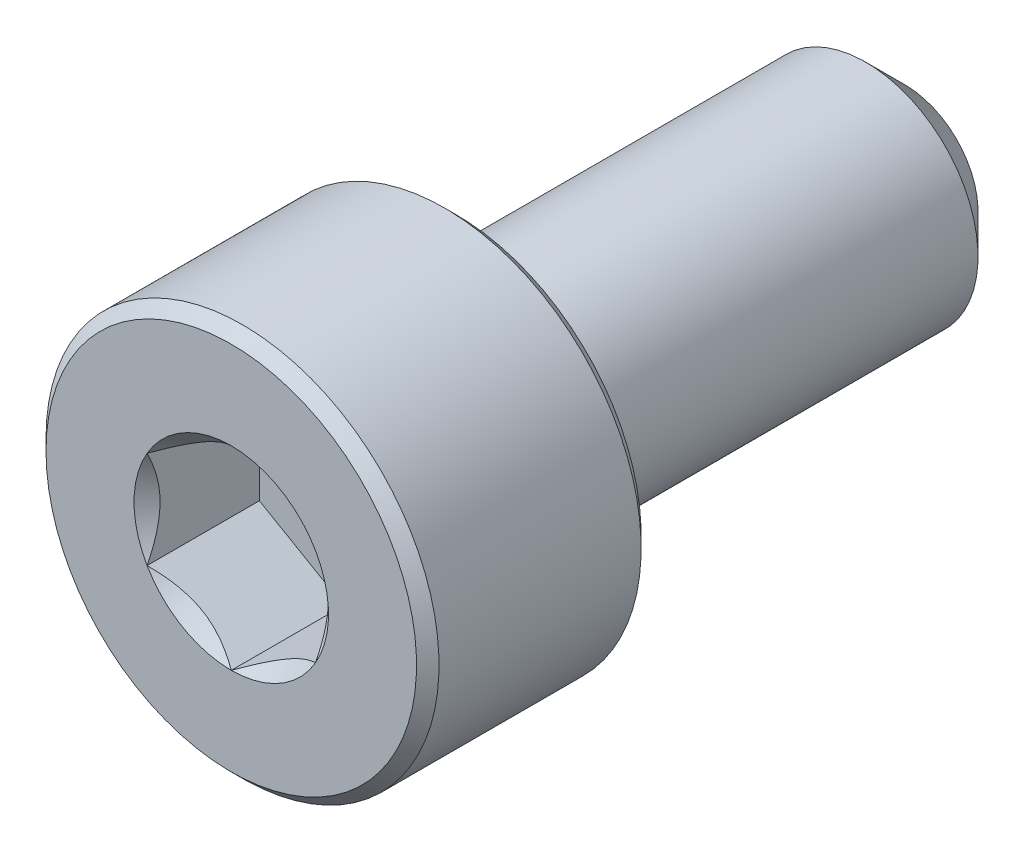
ISO-10303-21;
HEADER;
FILE_DESCRIPTION(('STEP AP214'),'2;1');
FILE_NAME('part.step','',(''),(''),'','','');
FILE_SCHEMA(('AUTOMOTIVE_DESIGN { 1 0 10303 214 1 1 1 1 }'));
ENDSEC;
DATA;
#1=APPLICATION_CONTEXT('core data for automotive mechanical design processes');
#2=APPLICATION_PROTOCOL_DEFINITION('international standard','automotive_design',2000,#1);
#3=PRODUCT_CONTEXT('',#1,'mechanical');
#4=PRODUCT('Part','Part','',(#3));
#5=PRODUCT_RELATED_PRODUCT_CATEGORY('part','',(#4));
#6=PRODUCT_DEFINITION_FORMATION('','',#4);
#7=PRODUCT_DEFINITION_CONTEXT('part definition',#1,'design');
#8=PRODUCT_DEFINITION('design','',#6,#7);
#9=PRODUCT_DEFINITION_SHAPE('','',#8);
#10=(LENGTH_UNIT() NAMED_UNIT(*) SI_UNIT(.MILLI.,.METRE.));
#11=(NAMED_UNIT(*) PLANE_ANGLE_UNIT() SI_UNIT($,.RADIAN.));
#12=(NAMED_UNIT(*) SI_UNIT($,.STERADIAN.) SOLID_ANGLE_UNIT());
#13=UNCERTAINTY_MEASURE_WITH_UNIT(LENGTH_MEASURE(1.E-05),#10,'distance_accuracy_value','');
#14=(GEOMETRIC_REPRESENTATION_CONTEXT(3) GLOBAL_UNCERTAINTY_ASSIGNED_CONTEXT((#13)) GLOBAL_UNIT_ASSIGNED_CONTEXT((#10,
#11,#12)) REPRESENTATION_CONTEXT('',''));
#15=CARTESIAN_POINT('',(0.,0.,0.));
#16=DIRECTION('',(0.,0.,1.));
#17=DIRECTION('',(1.,0.,0.));
#18=AXIS2_PLACEMENT_3D('',#15,#16,#17);
#19=CARTESIAN_POINT('',(0.,3.3,6.));
#20=DIRECTION('',(0.,0.,1.));
#21=DIRECTION('',(1.,0.,0.));
#22=AXIS2_PLACEMENT_3D('',#19,#20,#21);
#23=PLANE('',#22);
#24=CARTESIAN_POINT('',(0.,0.,6.));
#25=DIRECTION('',(0.,0.,1.));
#26=DIRECTION('',(1.,0.,0.));
#27=AXIS2_PLACEMENT_3D('',#24,#25,#26);
#28=CIRCLE('',#27,1.73205080756888);
#29=CARTESIAN_POINT('',(1.5,0.86602540378444,6.));
#30=VERTEX_POINT('',#29);
#31=CARTESIAN_POINT('',(0.,1.73205080756888,6.));
#32=VERTEX_POINT('',#31);
#33=EDGE_CURVE('E98',#30,#32,#28,.T.);
#34=ORIENTED_EDGE('',*,*,#33,.F.);
#35=CARTESIAN_POINT('',(1.5,-0.86602540378444,6.));
#36=VERTEX_POINT('',#35);
#37=EDGE_CURVE('E58',#36,#30,#28,.T.);
#38=ORIENTED_EDGE('',*,*,#37,.F.);
#39=CARTESIAN_POINT('',(0.,-1.73205080756888,6.));
#40=VERTEX_POINT('',#39);
#41=EDGE_CURVE('E284',#40,#36,#28,.T.);
#42=ORIENTED_EDGE('',*,*,#41,.F.);
#43=CARTESIAN_POINT('',(-1.5,-0.866025403784437,6.));
#44=VERTEX_POINT('',#43);
#45=EDGE_CURVE('E65',#44,#40,#28,.T.);
#46=ORIENTED_EDGE('',*,*,#45,.F.);
#47=CARTESIAN_POINT('',(-1.5,0.86602540378444,6.));
#48=VERTEX_POINT('',#47);
#49=EDGE_CURVE('E134',#48,#44,#28,.T.);
#50=ORIENTED_EDGE('',*,*,#49,.F.);
#51=EDGE_CURVE('E107',#32,#48,#28,.T.);
#52=ORIENTED_EDGE('',*,*,#51,.F.);
#53=EDGE_LOOP('',(#34,#38,#42,#46,#50,#52));
#54=FACE_BOUND('',#53,.T.);
#55=CARTESIAN_POINT('',(0.,0.,6.));
#56=DIRECTION('',(0.,0.,-1.));
#57=DIRECTION('',(-1.,0.,0.));
#58=AXIS2_PLACEMENT_3D('',#55,#56,#57);
#59=CIRCLE('',#58,3.3);
#60=CARTESIAN_POINT('',(-3.3,0.,6.));
#61=VERTEX_POINT('',#60);
#62=EDGE_CURVE('E52',#61,#61,#59,.T.);
#63=ORIENTED_EDGE('',*,*,#62,.F.);
#64=EDGE_LOOP('',(#63));
#65=FACE_BOUND('',#64,.T.);
#66=ADVANCED_FACE('F39',(#54,#65),#23,.T.);
#67=CARTESIAN_POINT('',(0.,0.,5.8));
#68=DIRECTION('',(0.,0.,-1.));
#69=DIRECTION('',(-1.,0.,0.));
#70=AXIS2_PLACEMENT_3D('',#67,#68,#69);
#71=CONICAL_SURFACE('',#70,3.5,0.785398163397445);
#72=ORIENTED_EDGE('',*,*,#62,.T.);
#73=EDGE_LOOP('',(#72));
#74=FACE_BOUND('',#73,.T.);
#75=CARTESIAN_POINT('',(0.,0.,5.8));
#76=DIRECTION('',(0.,0.,-1.));
#77=DIRECTION('',(-1.,0.,0.));
#78=AXIS2_PLACEMENT_3D('',#75,#76,#77);
#79=CIRCLE('',#78,3.5);
#80=CARTESIAN_POINT('',(-3.5,0.,5.8));
#81=VERTEX_POINT('',#80);
#82=EDGE_CURVE('E218',#81,#81,#79,.T.);
#83=ORIENTED_EDGE('',*,*,#82,.F.);
#84=EDGE_LOOP('',(#83));
#85=FACE_BOUND('',#84,.T.);
#86=ADVANCED_FACE('F223',(#74,#85),#71,.T.);
#87=CARTESIAN_POINT('',(0.,0.,-6.));
#88=DIRECTION('',(0.,0.,-1.));
#89=DIRECTION('',(-1.,0.,0.));
#90=AXIS2_PLACEMENT_3D('',#87,#88,#89);
#91=CYLINDRICAL_SURFACE('',#90,3.5);
#92=ORIENTED_EDGE('',*,*,#82,.T.);
#93=EDGE_LOOP('',(#92));
#94=FACE_BOUND('',#93,.T.);
#95=CARTESIAN_POINT('',(0.,0.,2.2));
#96=DIRECTION('',(0.,0.,-1.));
#97=DIRECTION('',(-1.,0.,0.));
#98=AXIS2_PLACEMENT_3D('',#95,#96,#97);
#99=CIRCLE('',#98,3.5);
#100=CARTESIAN_POINT('',(-3.5,0.,2.2));
#101=VERTEX_POINT('',#100);
#102=EDGE_CURVE('E215',#101,#101,#99,.T.);
#103=ORIENTED_EDGE('',*,*,#102,.F.);
#104=EDGE_LOOP('',(#103));
#105=FACE_BOUND('',#104,.T.);
#106=ADVANCED_FACE('F231',(#94,#105),#91,.T.);
#107=CARTESIAN_POINT('',(0.,0.,2.));
#108=DIRECTION('',(0.,0.,1.));
#109=DIRECTION('',(1.,0.,0.));
#110=AXIS2_PLACEMENT_3D('',#107,#108,#109);
#111=CONICAL_SURFACE('',#110,3.3,0.785398163397447);
#112=ORIENTED_EDGE('',*,*,#102,.T.);
#113=EDGE_LOOP('',(#112));
#114=FACE_BOUND('',#113,.T.);
#115=CARTESIAN_POINT('',(0.,0.,2.));
#116=DIRECTION('',(0.,0.,-1.));
#117=DIRECTION('',(-1.,0.,0.));
#118=AXIS2_PLACEMENT_3D('',#115,#116,#117);
#119=CIRCLE('',#118,3.3);
#120=CARTESIAN_POINT('',(-3.3,0.,2.));
#121=VERTEX_POINT('',#120);
#122=EDGE_CURVE('E212',#121,#121,#119,.T.);
#123=ORIENTED_EDGE('',*,*,#122,.F.);
#124=EDGE_LOOP('',(#123));
#125=FACE_BOUND('',#124,.T.);
#126=ADVANCED_FACE('F235',(#114,#125),#111,.T.);
#127=CARTESIAN_POINT('',(0.,3.3,2.));
#128=DIRECTION('',(0.,0.,-1.));
#129=DIRECTION('',(-1.,0.,0.));
#130=AXIS2_PLACEMENT_3D('',#127,#128,#129);
#131=PLANE('',#130);
#132=ORIENTED_EDGE('',*,*,#122,.T.);
#133=EDGE_LOOP('',(#132));
#134=FACE_BOUND('',#133,.T.);
#135=CARTESIAN_POINT('',(0.,0.,2.));
#136=DIRECTION('',(0.,0.,-1.));
#137=DIRECTION('',(-1.,0.,0.));
#138=AXIS2_PLACEMENT_3D('',#135,#136,#137);
#139=CIRCLE('',#138,2.);
#140=CARTESIAN_POINT('',(-2.,0.,2.));
#141=VERTEX_POINT('',#140);
#142=EDGE_CURVE('E209',#141,#141,#139,.T.);
#143=ORIENTED_EDGE('',*,*,#142,.F.);
#144=EDGE_LOOP('',(#143));
#145=FACE_BOUND('',#144,.T.);
#146=ADVANCED_FACE('F241',(#134,#145),#131,.T.);
#147=CARTESIAN_POINT('',(0.,0.,-6.));
#148=DIRECTION('',(0.,0.,-1.));
#149=DIRECTION('',(-1.,0.,0.));
#150=AXIS2_PLACEMENT_3D('',#147,#148,#149);
#151=CYLINDRICAL_SURFACE('',#150,2.);
#152=ORIENTED_EDGE('',*,*,#142,.T.);
#153=EDGE_LOOP('',(#152));
#154=FACE_BOUND('',#153,.T.);
#155=CARTESIAN_POINT('',(0.,0.,-5.29999999999999));
#156=DIRECTION('',(0.,0.,-1.));
#157=DIRECTION('',(-1.,0.,0.));
#158=AXIS2_PLACEMENT_3D('',#155,#156,#157);
#159=CIRCLE('',#158,2.);
#160=CARTESIAN_POINT('',(-2.,0.,-5.29999999999999));
#161=VERTEX_POINT('',#160);
#162=EDGE_CURVE('E206',#161,#161,#159,.T.);
#163=ORIENTED_EDGE('',*,*,#162,.F.);
#164=EDGE_LOOP('',(#163));
#165=FACE_BOUND('',#164,.T.);
#166=ADVANCED_FACE('F245',(#154,#165),#151,.T.);
#167=CARTESIAN_POINT('',(0.,0.,-6.));
#168=DIRECTION('',(0.,0.,1.));
#169=DIRECTION('',(1.,0.,0.));
#170=AXIS2_PLACEMENT_3D('',#167,#168,#169);
#171=CONICAL_SURFACE('',#170,1.3,0.785398163397443);
#172=ORIENTED_EDGE('',*,*,#162,.T.);
#173=EDGE_LOOP('',(#172));
#174=FACE_BOUND('',#173,.T.);
#175=CARTESIAN_POINT('',(0.,0.,-6.));
#176=DIRECTION('',(0.,0.,-1.));
#177=DIRECTION('',(-1.,0.,0.));
#178=AXIS2_PLACEMENT_3D('',#175,#176,#177);
#179=CIRCLE('',#178,1.3);
#180=CARTESIAN_POINT('',(-1.3,0.,-6.));
#181=VERTEX_POINT('',#180);
#182=EDGE_CURVE('E194',#181,#181,#179,.T.);
#183=ORIENTED_EDGE('',*,*,#182,.F.);
#184=EDGE_LOOP('',(#183));
#185=FACE_BOUND('',#184,.T.);
#186=ADVANCED_FACE('F248',(#174,#185),#171,.T.);
#187=CARTESIAN_POINT('',(0.,1.3,-6.));
#188=DIRECTION('',(0.,0.,-1.));
#189=DIRECTION('',(-1.,0.,0.));
#190=AXIS2_PLACEMENT_3D('',#187,#188,#189);
#191=PLANE('',#190);
#192=ORIENTED_EDGE('',*,*,#182,.T.);
#193=EDGE_LOOP('',(#192));
#194=FACE_BOUND('',#193,.T.);
#195=ADVANCED_FACE('F167',(#194),#191,.T.);
#196=CARTESIAN_POINT('',(0.,0.,6.));
#197=DIRECTION('',(0.,0.,1.));
#198=DIRECTION('',(1.,0.,0.));
#199=AXIS2_PLACEMENT_3D('',#196,#197,#198);
#200=CONICAL_SURFACE('',#199,1.73205080756888,0.78539816339745);
#201=ORIENTED_EDGE('',*,*,#51,.T.);
#202=CARTESIAN_POINT('',(0.000200000000000415,1.73216627762272,6.00011548160007));
#203=CARTESIAN_POINT('',(-0.0513677907370752,1.70239359975915,5.97036547606733));
#204=CARTESIAN_POINT('',(-0.1037979176652,1.67212305186355,5.94236248391031));
#205=CARTESIAN_POINT('',(-0.210709034055596,1.61039789003619,5.89108923044014));
#206=CARTESIAN_POINT('',(-0.265200195814661,1.57893740312614,5.86784750504437));
#207=CARTESIAN_POINT('',(-0.375079081357248,1.51549879897987,5.82803372899222));
#208=CARTESIAN_POINT('',(-0.430438809095199,1.4835368452681,5.8113615856709));
#209=CARTESIAN_POINT('',(-0.54237725747715,1.41890915196211,5.7856744568181));
#210=CARTESIAN_POINT('',(-0.598952556553008,1.38624538781118,5.77664029047887));
#211=CARTESIAN_POINT('',(-0.69645538951644,1.329952100953,5.76848908122685));
#212=CARTESIAN_POINT('',(-0.737256908280466,1.30639533311124,5.76728225298922));
#213=CARTESIAN_POINT('',(-0.818787969615858,1.25932335290193,5.76931405716227));
#214=CARTESIAN_POINT('',(-0.85951749431463,1.23580815085313,5.77255367074831));
#215=CARTESIAN_POINT('',(-0.940584402163416,1.18900414978427,5.78329198598196));
#216=CARTESIAN_POINT('',(-0.980921384598288,1.1657155821172,5.79079465301873));
#217=CARTESIAN_POINT('',(-1.06091833691403,1.11952932016335,5.80965161192829));
#218=CARTESIAN_POINT('',(-1.10057800851621,1.09663179808786,5.82100755701859));
#219=CARTESIAN_POINT('',(-1.20216313477448,1.03798159809698,5.85472164759267));
#220=CARTESIAN_POINT('',(-1.26345855370969,1.00259267147465,5.87962184909337));
#221=CARTESIAN_POINT('',(-1.35358562846331,0.950557780604375,5.92165665327158));
#222=CARTESIAN_POINT('',(-1.38328513990772,0.933410759677148,5.9364251535591));
#223=CARTESIAN_POINT('',(-1.44213790138375,0.899432101996407,5.96731056594017));
#224=CARTESIAN_POINT('',(-1.47129140422064,0.88260031928571,5.98342683412171));
#225=CARTESIAN_POINT('',(-1.5002,0.865909933730601,6.00011548160007));
#226=B_SPLINE_CURVE_WITH_KNOTS('',3,(#202,#203,#204,#205,#206,#207,#208,#209,#210,#211,#212,
#213,#214,#215,#216,#217,#218,#219,#220,#221,#222,#223,#224,#225),.UNSPECIFIED.,.F.,.F.,(4,2,2,
2,2,2,2,2,2,2,2,4),(0.,0.199829143693305,0.400822987382389,0.598623720538181,0.795926240188889,
0.937113067959881,1.07833105577193,1.21968061668222,1.36109089931054,1.58570969637565,
1.69770705470964,1.80965120737194),.UNSPECIFIED.);
#227=EDGE_CURVE('E11',#32,#48,#226,.T.);
#228=ORIENTED_EDGE('',*,*,#227,.F.);
#229=EDGE_LOOP('',(#201,#228));
#230=FACE_BOUND('',#229,.T.);
#231=ADVANCED_FACE('F111',(#230),#200,.F.);
#232=ORIENTED_EDGE('',*,*,#49,.T.);
#233=CARTESIAN_POINT('',(-1.5,-1.70094076570699,6.53581150933748));
#234=CARTESIAN_POINT('',(-1.5,-1.65940339844307,6.50466245356307));
#235=CARTESIAN_POINT('',(-1.5,-1.61763176138548,6.47382664603814));
#236=CARTESIAN_POINT('',(-1.5,-1.53352581710889,6.41291005817041));
#237=CARTESIAN_POINT('',(-1.5,-1.49119136858461,6.38282947313436));
#238=CARTESIAN_POINT('',(-1.5,-1.36258344501966,6.29348482963313));
#239=CARTESIAN_POINT('',(-1.5,-1.27533705988673,6.23559781348778));
#240=CARTESIAN_POINT('',(-1.5,-1.09255216894207,6.12219567429685));
#241=CARTESIAN_POINT('',(-1.5,-0.996821581803492,6.06698654757307));
#242=CARTESIAN_POINT('',(-1.5,-0.800613082291591,5.9661637894456));
#243=CARTESIAN_POINT('',(-1.5,-0.700152604862087,5.92051785177961));
#244=CARTESIAN_POINT('',(-1.5,-0.549105960820994,5.86468252969871));
#245=CARTESIAN_POINT('',(-1.5,-0.50070074362804,5.84861439232622));
#246=CARTESIAN_POINT('',(-1.5,-0.40274469507941,5.82036772251469));
#247=CARTESIAN_POINT('',(-1.5,-0.353193782853662,5.80818946555124));
#248=CARTESIAN_POINT('',(-1.5,-0.254057869430008,5.78855091399036));
#249=CARTESIAN_POINT('',(-1.5,-0.204488814603775,5.78101136158588));
#250=CARTESIAN_POINT('',(-1.5,-0.104849462627796,5.77079321692886));
#251=CARTESIAN_POINT('',(-1.5,-0.054779247575758,5.76811384119743));
#252=CARTESIAN_POINT('',(-1.5,0.0436737229088438,5.76780462686181));
#253=CARTESIAN_POINT('',(-1.5,0.0920560164094801,5.77000633072589));
#254=CARTESIAN_POINT('',(-1.5,0.188397733218518,5.77897258823616));
#255=CARTESIAN_POINT('',(-1.5,0.236357072029981,5.78573803359405));
#256=CARTESIAN_POINT('',(-1.5,0.332310053939587,5.80358163901288));
#257=CARTESIAN_POINT('',(-1.5,0.380290051019947,5.81473209678684));
#258=CARTESIAN_POINT('',(-1.5,0.475204866701384,5.84076106187732));
#259=CARTESIAN_POINT('',(-1.5,0.52213978119671,5.85563922560084));
#260=CARTESIAN_POINT('',(-1.5,0.671135849237721,5.90843439268167));
#261=CARTESIAN_POINT('',(-1.5,0.771043708402958,5.95241449643641));
#262=CARTESIAN_POINT('',(-1.5,0.96615432077171,6.05016194816059));
#263=CARTESIAN_POINT('',(-1.5,1.06133841027248,6.10396471049644));
#264=CARTESIAN_POINT('',(-1.5,1.24322962123133,6.21492426634355));
#265=CARTESIAN_POINT('',(-1.5,1.33012275327054,6.27177988846287));
#266=CARTESIAN_POINT('',(-1.5,1.45814294533514,6.35965573982338));
#267=CARTESIAN_POINT('',(-1.5,1.50026316125082,6.38925424362582));
#268=CARTESIAN_POINT('',(-1.5,1.58392901779071,6.44922957252824));
#269=CARTESIAN_POINT('',(-1.5,1.62547481197907,6.47960618316485));
#270=CARTESIAN_POINT('',(-1.5,1.66678158585385,6.51030528702036));
#271=B_SPLINE_CURVE_WITH_KNOTS('',3,(#233,#234,#235,#236,#237,#238,#239,#240,#241,#242,#243,
#244,#245,#246,#247,#248,#249,#250,#251,#252,#253,#254,#255,#256,#257,#258,#259,#260,#261,#262,
#263,#264,#265,#266,#267,#268,#269,#270),.UNSPECIFIED.,.F.,.F.,(4,2,2,2,2,2,2,2,2,2,2,2,2,2,2,2,
2,2,4),(0.,0.155753948201002,0.311547769199354,0.625513832410582,0.956763614654479,
1.28687565594417,1.43975300144579,1.59264117109685,1.74283872260253,1.89301205954152,
2.03808349452257,2.1831832832956,2.33078307442231,2.47836926586908,2.80488410158813,
3.13260026706957,3.44396956433299,3.59840353500356,3.75279538879849),.UNSPECIFIED.);
#272=EDGE_CURVE('E106',#48,#44,#271,.F.);
#273=ORIENTED_EDGE('',*,*,#272,.F.);
#274=EDGE_LOOP('',(#232,#273));
#275=FACE_BOUND('',#274,.T.);
#276=ADVANCED_FACE('F262',(#275),#200,.F.);
#277=ORIENTED_EDGE('',*,*,#45,.T.);
#278=CARTESIAN_POINT('',(-1.5002,-0.865909933730601,6.00011548160007));
#279=CARTESIAN_POINT('',(-1.44863220926292,-0.895682611594166,5.97036547606733));
#280=CARTESIAN_POINT('',(-1.3962020823348,-0.925953159489765,5.94236248391031));
#281=CARTESIAN_POINT('',(-1.2892909659444,-0.987678321317124,5.89108923044014));
#282=CARTESIAN_POINT('',(-1.23479980418534,-1.01913880822717,5.86784750504437));
#283=CARTESIAN_POINT('',(-1.12492091864275,-1.08257741237344,5.82803372899222));
#284=CARTESIAN_POINT('',(-1.0695611909048,-1.11453936608521,5.8113615856709));
#285=CARTESIAN_POINT('',(-0.95762274252285,-1.1791670593912,5.7856744568181));
#286=CARTESIAN_POINT('',(-0.901047443446992,-1.21183082354213,5.77664029047887));
#287=CARTESIAN_POINT('',(-0.80354461048356,-1.26812411040032,5.76848908122685));
#288=CARTESIAN_POINT('',(-0.762743091719535,-1.29168087824208,5.76728225298922));
#289=CARTESIAN_POINT('',(-0.681212030384143,-1.33875285845138,5.76931405716227));
#290=CARTESIAN_POINT('',(-0.640482505685371,-1.36226806050018,5.77255367074831));
#291=CARTESIAN_POINT('',(-0.559415597836585,-1.40907206156905,5.78329198598196));
#292=CARTESIAN_POINT('',(-0.519078615401713,-1.43236062923612,5.79079465301873));
#293=CARTESIAN_POINT('',(-0.439081663085971,-1.47854689118996,5.80965161192829));
#294=CARTESIAN_POINT('',(-0.399421991483793,-1.50144441326545,5.82100755701859));
#295=CARTESIAN_POINT('',(-0.297836865225516,-1.56009461325633,5.85472164759267));
#296=CARTESIAN_POINT('',(-0.236541446290312,-1.59548353987866,5.87962184909337));
#297=CARTESIAN_POINT('',(-0.146414371536687,-1.64751843074894,5.92165665327158));
#298=CARTESIAN_POINT('',(-0.116714860092283,-1.66466545167617,5.9364251535591));
#299=CARTESIAN_POINT('',(-0.0578620986162492,-1.69864410935691,5.96731056594017));
#300=CARTESIAN_POINT('',(-0.028708595779363,-1.71547589206761,5.98342683412171));
#301=CARTESIAN_POINT('',(0.000199999999999664,-1.73216627762272,6.00011548160007));
#302=B_SPLINE_CURVE_WITH_KNOTS('',3,(#278,#279,#280,#281,#282,#283,#284,#285,#286,#287,#288,
#289,#290,#291,#292,#293,#294,#295,#296,#297,#298,#299,#300,#301),.UNSPECIFIED.,.F.,.F.,(4,2,2,
2,2,2,2,2,2,2,2,4),(0.,0.199829143693305,0.400822987382389,0.59862372053818,0.795926240188889,
0.937113067959881,1.07833105577193,1.21968061668222,1.36109089931054,1.58570969637565,
1.69770705470964,1.80965120737194),.UNSPECIFIED.);
#303=EDGE_CURVE('E143',#44,#40,#302,.T.);
#304=ORIENTED_EDGE('',*,*,#303,.F.);
#305=EDGE_LOOP('',(#277,#304));
#306=FACE_BOUND('',#305,.T.);
#307=ADVANCED_FACE('F266',(#306),#200,.F.);
#308=ORIENTED_EDGE('',*,*,#41,.T.);
#309=CARTESIAN_POINT('',(-0.000200000000000533,-1.73216627762272,6.00011548160007));
#310=CARTESIAN_POINT('',(0.0513677907370751,-1.70239359975915,5.97036547606733));
#311=CARTESIAN_POINT('',(0.1037979176652,-1.67212305186355,5.94236248391031));
#312=CARTESIAN_POINT('',(0.210709034055596,-1.61039789003619,5.89108923044014));
#313=CARTESIAN_POINT('',(0.265200195814661,-1.57893740312614,5.86784750504437));
#314=CARTESIAN_POINT('',(0.375079081357248,-1.51549879897987,5.82803372899222));
#315=CARTESIAN_POINT('',(0.430438809095199,-1.4835368452681,5.8113615856709));
#316=CARTESIAN_POINT('',(0.54237725747715,-1.41890915196211,5.7856744568181));
#317=CARTESIAN_POINT('',(0.598952556553008,-1.38624538781118,5.77664029047887));
#318=CARTESIAN_POINT('',(0.696455389516441,-1.329952100953,5.76848908122685));
#319=CARTESIAN_POINT('',(0.737256908280466,-1.30639533311124,5.76728225298922));
#320=CARTESIAN_POINT('',(0.818787969615858,-1.25932335290193,5.76931405716227));
#321=CARTESIAN_POINT('',(0.85951749431463,-1.23580815085313,5.77255367074831));
#322=CARTESIAN_POINT('',(0.940584402163416,-1.18900414978427,5.78329198598196));
#323=CARTESIAN_POINT('',(0.980921384598288,-1.1657155821172,5.79079465301873));
#324=CARTESIAN_POINT('',(1.06091833691403,-1.11952932016335,5.80965161192829));
#325=CARTESIAN_POINT('',(1.10057800851621,-1.09663179808786,5.82100755701859));
#326=CARTESIAN_POINT('',(1.20216313477448,-1.03798159809698,5.85472164759267));
#327=CARTESIAN_POINT('',(1.26345855370969,-1.00259267147465,5.87962184909337));
#328=CARTESIAN_POINT('',(1.35358562846331,-0.950557780604375,5.92165665327158));
#329=CARTESIAN_POINT('',(1.38328513990772,-0.933410759677148,5.9364251535591));
#330=CARTESIAN_POINT('',(1.44213790138375,-0.899432101996408,5.96731056594017));
#331=CARTESIAN_POINT('',(1.47129140422064,-0.882600319285711,5.98342683412171));
#332=CARTESIAN_POINT('',(1.5002,-0.865909933730602,6.00011548160007));
#333=B_SPLINE_CURVE_WITH_KNOTS('',3,(#309,#310,#311,#312,#313,#314,#315,#316,#317,#318,#319,
#320,#321,#322,#323,#324,#325,#326,#327,#328,#329,#330,#331,#332),.UNSPECIFIED.,.F.,.F.,(4,2,2,
2,2,2,2,2,2,2,2,4),(0.,0.199829143693305,0.400822987382389,0.598623720538181,0.79592624018889,
0.937113067959882,1.07833105577193,1.21968061668222,1.36109089931054,1.58570969637565,
1.69770705470964,1.80965120737194),.UNSPECIFIED.);
#334=EDGE_CURVE('E286',#40,#36,#333,.T.);
#335=ORIENTED_EDGE('',*,*,#334,.F.);
#336=EDGE_LOOP('',(#308,#335));
#337=FACE_BOUND('',#336,.T.);
#338=ADVANCED_FACE('F274',(#337),#200,.F.);
#339=ORIENTED_EDGE('',*,*,#37,.T.);
#340=CARTESIAN_POINT('',(1.5,-1.70094076506827,6.53581150885843));
#341=CARTESIAN_POINT('',(1.5,-1.65940339782208,6.50466245310244));
#342=CARTESIAN_POINT('',(1.5,-1.61763176078228,6.47382664559589));
#343=CARTESIAN_POINT('',(1.5,-1.53352581654146,6.41291005776482));
#344=CARTESIAN_POINT('',(1.5,-1.49119136803515,6.38282947274705));
#345=CARTESIAN_POINT('',(1.5,-1.36258344452521,6.29348482930099));
#346=CARTESIAN_POINT('',(1.5,-1.2753370594297,6.23559781319227));
#347=CARTESIAN_POINT('',(1.5,-1.09255216856664,6.1221956740766));
#348=CARTESIAN_POINT('',(1.5,-0.996821581472455,6.06698654739118));
#349=CARTESIAN_POINT('',(1.5,-0.800613082053126,5.96616378933478));
#350=CARTESIAN_POINT('',(1.5,-0.70015260467177,5.92051785170157));
#351=CARTESIAN_POINT('',(1.5,-0.549105960667007,5.86468252964533));
#352=CARTESIAN_POINT('',(1.5,-0.500700743459033,5.8486143922722));
#353=CARTESIAN_POINT('',(1.5,-0.402744694879906,5.82036772246244));
#354=CARTESIAN_POINT('',(1.5,-0.353193782638679,5.80818946550141));
#355=CARTESIAN_POINT('',(1.5,-0.254057869184596,5.78855091394885));
#356=CARTESIAN_POINT('',(1.5,-0.204488814343416,5.78101136155019));
#357=CARTESIAN_POINT('',(1.5,-0.104849462338082,5.77079321690814));
#358=CARTESIAN_POINT('',(1.5,-0.0547792472716355,5.76811384118586));
#359=CARTESIAN_POINT('',(1.5,0.0436737232403031,5.76780462687103));
#360=CARTESIAN_POINT('',(1.5,0.0920560167539034,5.77000633074664));
#361=CARTESIAN_POINT('',(1.5,0.188397733587633,5.77897258828183));
#362=CARTESIAN_POINT('',(1.5,0.236357072410825,5.78573803365309));
#363=CARTESIAN_POINT('',(1.5,0.332310054343575,5.80358163910001));
#364=CARTESIAN_POINT('',(1.5,0.380290051435319,5.81473209688875));
#365=CARTESIAN_POINT('',(1.5,0.475204867138459,5.84076106200917));
#366=CARTESIAN_POINT('',(1.5,0.522139781644104,5.85563922574786));
#367=CARTESIAN_POINT('',(1.5,0.671135849783409,5.90843439290061));
#368=CARTESIAN_POINT('',(1.5,0.77104370903169,5.9524144967216));
#369=CARTESIAN_POINT('',(1.5,0.966154321560162,6.05016194858557));
#370=CARTESIAN_POINT('',(1.5,1.06133841113756,6.103964710995));
#371=CARTESIAN_POINT('',(1.5,1.24322962223427,6.21492426698296));
#372=CARTESIAN_POINT('',(1.5,1.33012275433518,6.2717798891689));
#373=CARTESIAN_POINT('',(1.5,1.45814294649102,6.359655740629));
#374=CARTESIAN_POINT('',(1.5,1.50026316243668,6.38925424446438));
#375=CARTESIAN_POINT('',(1.5,1.58392901903633,6.44922957343262));
#376=CARTESIAN_POINT('',(1.5,1.62547481325447,6.47960618410212));
#377=CARTESIAN_POINT('',(1.5,1.66678158715899,6.51030528799048));
#378=B_SPLINE_CURVE_WITH_KNOTS('',3,(#340,#341,#342,#343,#344,#345,#346,#347,#348,#349,#350,
#351,#352,#353,#354,#355,#356,#357,#358,#359,#360,#361,#362,#363,#364,#365,#366,#367,#368,#369,
#370,#371,#372,#373,#374,#375,#376,#377),.UNSPECIFIED.,.F.,.F.,(4,2,2,2,2,2,2,2,2,2,2,2,2,2,2,2,
2,2,4),(0.,0.155753948125308,0.311547769047944,0.625513832104916,0.956763614176022,
1.28687565529455,1.43975300083938,1.59264117053358,1.74283872208071,1.89301205906115,
2.03808349408246,2.18318328289586,2.33078307406585,2.47836926555587,2.80488410158167,
3.1326002673719,3.44396956489969,3.59840353570064,3.75279538962596),.UNSPECIFIED.);
#379=EDGE_CURVE('E123',#36,#30,#378,.T.);
#380=ORIENTED_EDGE('',*,*,#379,.F.);
#381=EDGE_LOOP('',(#339,#380));
#382=FACE_BOUND('',#381,.T.);
#383=ADVANCED_FACE('F269',(#382),#200,.F.);
#384=ORIENTED_EDGE('',*,*,#33,.T.);
#385=CARTESIAN_POINT('',(1.5002,0.865909933730602,6.00011548160007));
#386=CARTESIAN_POINT('',(1.44863220926292,0.895682611594167,5.97036547606733));
#387=CARTESIAN_POINT('',(1.3962020823348,0.925953159489766,5.94236248391031));
#388=CARTESIAN_POINT('',(1.2892909659444,0.987678321317125,5.89108923044014));
#389=CARTESIAN_POINT('',(1.23479980418534,1.01913880822718,5.86784750504437));
#390=CARTESIAN_POINT('',(1.12492091864275,1.08257741237344,5.82803372899222));
#391=CARTESIAN_POINT('',(1.0695611909048,1.11453936608522,5.8113615856709));
#392=CARTESIAN_POINT('',(0.957622742522849,1.1791670593912,5.7856744568181));
#393=CARTESIAN_POINT('',(0.901047443446991,1.21183082354213,5.77664029047887));
#394=CARTESIAN_POINT('',(0.803544610483559,1.26812411040032,5.76848908122685));
#395=CARTESIAN_POINT('',(0.762743091719533,1.29168087824208,5.76728225298922));
#396=CARTESIAN_POINT('',(0.681212030384141,1.33875285845138,5.76931405716227));
#397=CARTESIAN_POINT('',(0.64048250568537,1.36226806050018,5.77255367074831));
#398=CARTESIAN_POINT('',(0.559415597836583,1.40907206156905,5.78329198598196));
#399=CARTESIAN_POINT('',(0.519078615401711,1.43236062923612,5.79079465301873));
#400=CARTESIAN_POINT('',(0.439081663085969,1.47854689118997,5.80965161192829));
#401=CARTESIAN_POINT('',(0.399421991483792,1.50144441326545,5.82100755701859));
#402=CARTESIAN_POINT('',(0.297836865225515,1.56009461325633,5.85472164759267));
#403=CARTESIAN_POINT('',(0.236541446290311,1.59548353987866,5.87962184909337));
#404=CARTESIAN_POINT('',(0.146414371536687,1.64751843074894,5.92165665327158));
#405=CARTESIAN_POINT('',(0.116714860092283,1.66466545167617,5.9364251535591));
#406=CARTESIAN_POINT('',(0.0578620986162494,1.69864410935691,5.96731056594017));
#407=CARTESIAN_POINT('',(0.028708595779363,1.71547589206761,5.98342683412171));
#408=CARTESIAN_POINT('',(-0.000199999999999924,1.73216627762272,6.00011548160007));
#409=B_SPLINE_CURVE_WITH_KNOTS('',3,(#385,#386,#387,#388,#389,#390,#391,#392,#393,#394,#395,
#396,#397,#398,#399,#400,#401,#402,#403,#404,#405,#406,#407,#408),.UNSPECIFIED.,.F.,.F.,(4,2,2,
2,2,2,2,2,2,2,2,4),(0.,0.199829143693305,0.400822987382388,0.59862372053818,0.795926240188888,
0.93711306795988,1.07833105577193,1.21968061668222,1.36109089931054,1.58570969637565,
1.69770705470963,1.80965120737194),.UNSPECIFIED.);
#410=EDGE_CURVE('E102',#30,#32,#409,.T.);
#411=ORIENTED_EDGE('',*,*,#410,.F.);
#412=EDGE_LOOP('',(#384,#411));
#413=FACE_BOUND('',#412,.T.);
#414=ADVANCED_FACE('F100',(#413),#200,.F.);
#415=CARTESIAN_POINT('',(0.,0.,4.));
#416=DIRECTION('',(0.,0.,1.));
#417=DIRECTION('',(1.,0.,0.));
#418=AXIS2_PLACEMENT_3D('',#415,#416,#417);
#419=PLANE('',#418);
#420=DIRECTION('',(-0.866025403784439,0.5,0.));
#421=VECTOR('',#420,1.);
#422=CARTESIAN_POINT('',(1.5,0.86602540378444,4.));
#423=LINE('',#422,#421);
#424=CARTESIAN_POINT('',(1.5,0.86602540378444,4.));
#425=VERTEX_POINT('',#424);
#426=CARTESIAN_POINT('',(0.,1.73205080756888,4.));
#427=VERTEX_POINT('',#426);
#428=EDGE_CURVE('E122',#425,#427,#423,.T.);
#429=ORIENTED_EDGE('',*,*,#428,.T.);
#430=DIRECTION('',(-0.866025403784439,-0.5,0.));
#431=VECTOR('',#430,1.);
#432=CARTESIAN_POINT('',(0.,1.73205080756888,4.));
#433=LINE('',#432,#431);
#434=CARTESIAN_POINT('',(-1.5,0.866025403784439,4.));
#435=VERTEX_POINT('',#434);
#436=EDGE_CURVE('E127',#427,#435,#433,.T.);
#437=ORIENTED_EDGE('',*,*,#436,.T.);
#438=DIRECTION('',(0.,-1.,0.));
#439=VECTOR('',#438,1.);
#440=CARTESIAN_POINT('',(-1.5,0.866025403784439,4.));
#441=LINE('',#440,#439);
#442=CARTESIAN_POINT('',(-1.5,-0.866025403784439,4.));
#443=VERTEX_POINT('',#442);
#444=EDGE_CURVE('E182',#435,#443,#441,.T.);
#445=ORIENTED_EDGE('',*,*,#444,.T.);
#446=DIRECTION('',(0.866025403784439,-0.5,0.));
#447=VECTOR('',#446,1.);
#448=CARTESIAN_POINT('',(-1.5,-0.866025403784439,4.));
#449=LINE('',#448,#447);
#450=CARTESIAN_POINT('',(0.,-1.73205080756888,4.));
#451=VERTEX_POINT('',#450);
#452=EDGE_CURVE('E185',#443,#451,#449,.T.);
#453=ORIENTED_EDGE('',*,*,#452,.T.);
#454=DIRECTION('',(0.866025403784439,0.5,0.));
#455=VECTOR('',#454,1.);
#456=CARTESIAN_POINT('',(0.,-1.73205080756888,4.));
#457=LINE('',#456,#455);
#458=CARTESIAN_POINT('',(1.5,-0.86602540378444,4.));
#459=VERTEX_POINT('',#458);
#460=EDGE_CURVE('E188',#451,#459,#457,.T.);
#461=ORIENTED_EDGE('',*,*,#460,.T.);
#462=DIRECTION('',(0.,1.,0.));
#463=VECTOR('',#462,1.);
#464=CARTESIAN_POINT('',(1.5,-0.86602540378444,4.));
#465=LINE('',#464,#463);
#466=EDGE_CURVE('E130',#459,#425,#465,.T.);
#467=ORIENTED_EDGE('',*,*,#466,.T.);
#468=EDGE_LOOP('',(#429,#437,#445,#453,#461,#467));
#469=FACE_BOUND('',#468,.T.);
#470=ADVANCED_FACE('F162',(#469),#419,.T.);
#471=CARTESIAN_POINT('',(0.,1.73205080756888,4.));
#472=DIRECTION('',(-0.5,0.866025403784439,0.));
#473=DIRECTION('',(-0.866025403784439,-0.5,0.));
#474=AXIS2_PLACEMENT_3D('',#471,#472,#473);
#475=PLANE('',#474);
#476=DIRECTION('',(0.,0.,1.));
#477=VECTOR('',#476,1.);
#478=CARTESIAN_POINT('',(0.,1.73205080756888,4.));
#479=LINE('',#478,#477);
#480=EDGE_CURVE('E119',#427,#32,#479,.T.);
#481=ORIENTED_EDGE('',*,*,#480,.T.);
#482=ORIENTED_EDGE('',*,*,#227,.T.);
#483=DIRECTION('',(0.,0.,1.));
#484=VECTOR('',#483,1.);
#485=CARTESIAN_POINT('',(-1.5,0.866025403784439,4.));
#486=LINE('',#485,#484);
#487=EDGE_CURVE('E129',#435,#48,#486,.T.);
#488=ORIENTED_EDGE('',*,*,#487,.F.);
#489=ORIENTED_EDGE('',*,*,#436,.F.);
#490=EDGE_LOOP('',(#481,#482,#488,#489));
#491=FACE_BOUND('',#490,.T.);
#492=ADVANCED_FACE('F125',(#491),#475,.F.);
#493=CARTESIAN_POINT('',(-1.5,0.866025403784439,4.));
#494=DIRECTION('',(-1.,0.,0.));
#495=DIRECTION('',(0.,-1.,0.));
#496=AXIS2_PLACEMENT_3D('',#493,#494,#495);
#497=PLANE('',#496);
#498=ORIENTED_EDGE('',*,*,#487,.T.);
#499=ORIENTED_EDGE('',*,*,#272,.T.);
#500=DIRECTION('',(0.,0.,1.));
#501=VECTOR('',#500,1.);
#502=CARTESIAN_POINT('',(-1.5,-0.866025403784439,4.));
#503=LINE('',#502,#501);
#504=EDGE_CURVE('E200',#443,#44,#503,.T.);
#505=ORIENTED_EDGE('',*,*,#504,.F.);
#506=ORIENTED_EDGE('',*,*,#444,.F.);
#507=EDGE_LOOP('',(#498,#499,#505,#506));
#508=FACE_BOUND('',#507,.T.);
#509=ADVANCED_FACE('F152',(#508),#497,.F.);
#510=CARTESIAN_POINT('',(-1.5,-0.866025403784439,4.));
#511=DIRECTION('',(-0.5,-0.866025403784439,0.));
#512=DIRECTION('',(0.866025403784439,-0.5,0.));
#513=AXIS2_PLACEMENT_3D('',#510,#511,#512);
#514=PLANE('',#513);
#515=ORIENTED_EDGE('',*,*,#504,.T.);
#516=ORIENTED_EDGE('',*,*,#303,.T.);
#517=DIRECTION('',(0.,0.,1.));
#518=VECTOR('',#517,1.);
#519=CARTESIAN_POINT('',(0.,-1.73205080756888,4.));
#520=LINE('',#519,#518);
#521=EDGE_CURVE('E197',#451,#40,#520,.T.);
#522=ORIENTED_EDGE('',*,*,#521,.F.);
#523=ORIENTED_EDGE('',*,*,#452,.F.);
#524=EDGE_LOOP('',(#515,#516,#522,#523));
#525=FACE_BOUND('',#524,.T.);
#526=ADVANCED_FACE('F155',(#525),#514,.F.);
#527=CARTESIAN_POINT('',(0.,-1.73205080756888,4.));
#528=DIRECTION('',(0.5,-0.866025403784439,0.));
#529=DIRECTION('',(0.866025403784439,0.5,0.));
#530=AXIS2_PLACEMENT_3D('',#527,#528,#529);
#531=PLANE('',#530);
#532=ORIENTED_EDGE('',*,*,#521,.T.);
#533=ORIENTED_EDGE('',*,*,#334,.T.);
#534=DIRECTION('',(0.,0.,1.));
#535=VECTOR('',#534,1.);
#536=CARTESIAN_POINT('',(1.5,-0.86602540378444,4.));
#537=LINE('',#536,#535);
#538=EDGE_CURVE('E195',#459,#36,#537,.T.);
#539=ORIENTED_EDGE('',*,*,#538,.F.);
#540=ORIENTED_EDGE('',*,*,#460,.F.);
#541=EDGE_LOOP('',(#532,#533,#539,#540));
#542=FACE_BOUND('',#541,.T.);
#543=ADVANCED_FACE('F292',(#542),#531,.F.);
#544=CARTESIAN_POINT('',(1.5,-0.86602540378444,4.));
#545=DIRECTION('',(1.,0.,0.));
#546=DIRECTION('',(0.,0.,-1.));
#547=AXIS2_PLACEMENT_3D('',#544,#545,#546);
#548=PLANE('',#547);
#549=ORIENTED_EDGE('',*,*,#538,.T.);
#550=ORIENTED_EDGE('',*,*,#379,.T.);
#551=DIRECTION('',(0.,0.,1.));
#552=VECTOR('',#551,1.);
#553=CARTESIAN_POINT('',(1.5,0.86602540378444,4.));
#554=LINE('',#553,#552);
#555=EDGE_CURVE('E121',#425,#30,#554,.T.);
#556=ORIENTED_EDGE('',*,*,#555,.F.);
#557=ORIENTED_EDGE('',*,*,#466,.F.);
#558=EDGE_LOOP('',(#549,#550,#556,#557));
#559=FACE_BOUND('',#558,.T.);
#560=ADVANCED_FACE('F166',(#559),#548,.F.);
#561=CARTESIAN_POINT('',(1.5,0.86602540378444,4.));
#562=DIRECTION('',(0.5,0.866025403784439,0.));
#563=DIRECTION('',(-0.866025403784439,0.5,0.));
#564=AXIS2_PLACEMENT_3D('',#561,#562,#563);
#565=PLANE('',#564);
#566=ORIENTED_EDGE('',*,*,#555,.T.);
#567=ORIENTED_EDGE('',*,*,#410,.T.);
#568=ORIENTED_EDGE('',*,*,#480,.F.);
#569=ORIENTED_EDGE('',*,*,#428,.F.);
#570=EDGE_LOOP('',(#566,#567,#568,#569));
#571=FACE_BOUND('',#570,.T.);
#572=ADVANCED_FACE('F117',(#571),#565,.F.);
#573=CLOSED_SHELL('',(#66,#86,#106,#126,#146,#166,#186,#195,#231,#276,#307,#338,#383,#414,#470,
#492,#509,#526,#543,#560,#572));
#574=MANIFOLD_SOLID_BREP('B2',#573);
#575=ADVANCED_BREP_SHAPE_REPRESENTATION('',(#18,#574),#14);
#576=SHAPE_DEFINITION_REPRESENTATION(#9,#575);
ENDSEC;
END-ISO-10303-21;
